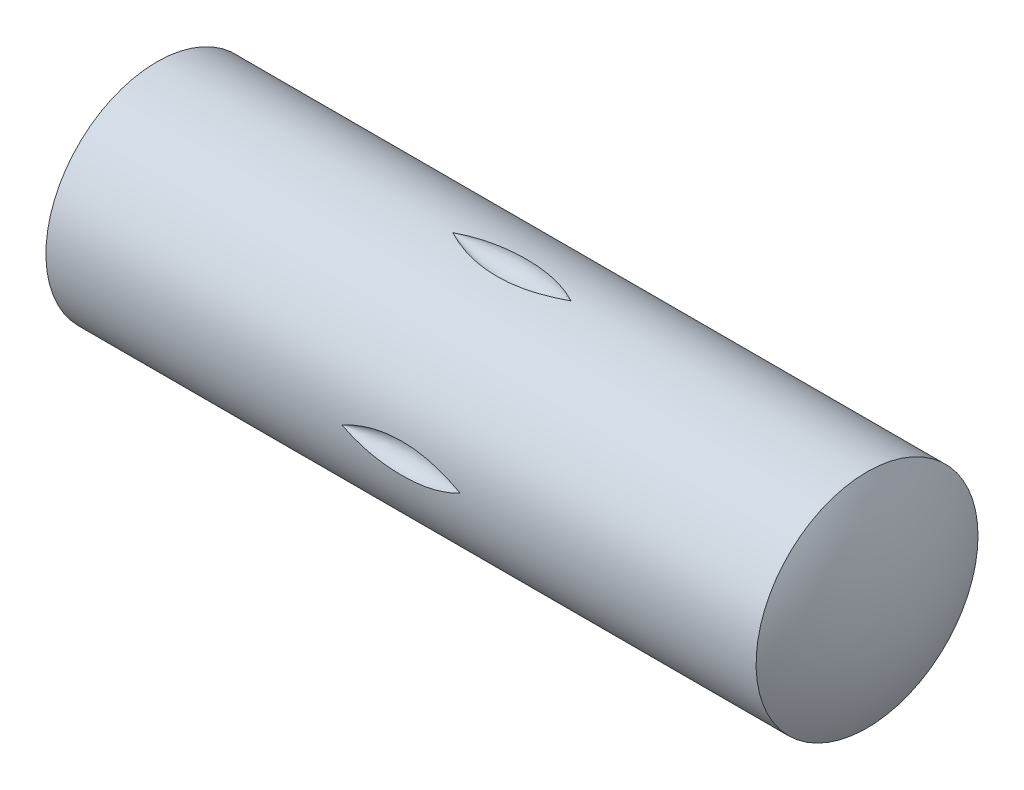
ISO-10303-21;
HEADER;
FILE_DESCRIPTION(('STEP AP214'),'2;1');
FILE_NAME('part.step','',(''),(''),'','','');
FILE_SCHEMA(('AUTOMOTIVE_DESIGN { 1 0 10303 214 1 1 1 1 }'));
ENDSEC;
DATA;
#1=APPLICATION_CONTEXT('core data for automotive mechanical design processes');
#2=APPLICATION_PROTOCOL_DEFINITION('international standard','automotive_design',2000,#1);
#3=PRODUCT_CONTEXT('',#1,'mechanical');
#4=PRODUCT('Part','Part','',(#3));
#5=PRODUCT_RELATED_PRODUCT_CATEGORY('part','',(#4));
#6=PRODUCT_DEFINITION_FORMATION('','',#4);
#7=PRODUCT_DEFINITION_CONTEXT('part definition',#1,'design');
#8=PRODUCT_DEFINITION('design','',#6,#7);
#9=PRODUCT_DEFINITION_SHAPE('','',#8);
#10=(LENGTH_UNIT() NAMED_UNIT(*) SI_UNIT(.MILLI.,.METRE.));
#11=(NAMED_UNIT(*) PLANE_ANGLE_UNIT() SI_UNIT($,.RADIAN.));
#12=(NAMED_UNIT(*) SI_UNIT($,.STERADIAN.) SOLID_ANGLE_UNIT());
#13=UNCERTAINTY_MEASURE_WITH_UNIT(LENGTH_MEASURE(1.E-05),#10,'distance_accuracy_value','');
#14=(GEOMETRIC_REPRESENTATION_CONTEXT(3) GLOBAL_UNCERTAINTY_ASSIGNED_CONTEXT((#13)) GLOBAL_UNIT_ASSIGNED_CONTEXT((#10,
#11,#12)) REPRESENTATION_CONTEXT('',''));
#15=CARTESIAN_POINT('',(0.,0.,0.));
#16=DIRECTION('',(0.,0.,1.));
#17=DIRECTION('',(1.,0.,0.));
#18=AXIS2_PLACEMENT_3D('',#15,#16,#17);
#19=CARTESIAN_POINT('',(-3.67082089552239,0.,0.));
#20=DIRECTION('',(1.,0.,0.));
#21=DIRECTION('',(0.,1.,0.));
#22=AXIS2_PLACEMENT_3D('',#19,#20,#21);
#23=SPHERICAL_SURFACE('',#22,4.99917910447761);
#24=CARTESIAN_POINT('',(-8.,0.,0.));
#25=DIRECTION('',(1.,0.,0.));
#26=DIRECTION('',(0.,0.,-0.999999999999999));
#27=AXIS2_PLACEMENT_3D('',#24,#25,#26);
#28=CIRCLE('',#27,2.5);
#29=CARTESIAN_POINT('',(-8.,0.,-2.5));
#30=VERTEX_POINT('',#29);
#31=EDGE_CURVE('E94',#30,#30,#28,.T.);
#32=ORIENTED_EDGE('',*,*,#31,.F.);
#33=EDGE_LOOP('',(#32));
#34=FACE_BOUND('',#33,.T.);
#35=ADVANCED_FACE('F31',(#34),#23,.T.);
#36=CARTESIAN_POINT('',(3.67082089552239,0.,0.));
#37=DIRECTION('',(1.,0.,0.));
#38=DIRECTION('',(0.,1.,0.));
#39=AXIS2_PLACEMENT_3D('',#36,#37,#38);
#40=SPHERICAL_SURFACE('',#39,4.99917910447761);
#41=CARTESIAN_POINT('',(8.,0.,0.));
#42=DIRECTION('',(1.,0.,0.));
#43=DIRECTION('',(0.,0.,-0.999999999999999));
#44=AXIS2_PLACEMENT_3D('',#41,#42,#43);
#45=CIRCLE('',#44,2.5);
#46=CARTESIAN_POINT('',(8.,0.,-2.5));
#47=VERTEX_POINT('',#46);
#48=EDGE_CURVE('E91',#47,#47,#45,.T.);
#49=ORIENTED_EDGE('',*,*,#48,.T.);
#50=EDGE_LOOP('',(#49));
#51=FACE_BOUND('',#50,.T.);
#52=ADVANCED_FACE('F77',(#51),#40,.T.);
#53=CARTESIAN_POINT('',(0.,0.,0.));
#54=DIRECTION('',(1.,0.,0.));
#55=DIRECTION('',(0.,0.,-0.999999999999999));
#56=AXIS2_PLACEMENT_3D('',#53,#54,#55);
#57=CYLINDRICAL_SURFACE('',#56,2.5);
#58=CARTESIAN_POINT('',(1.33333333333333,0.,2.5));
#59=CARTESIAN_POINT('',(1.33332368564111,5.17462142847804E-06,2.50000000000001));
#60=CARTESIAN_POINT('',(1.33331403791877,1.03491866655168E-05,2.49999999998396));
#61=CARTESIAN_POINT('',(1.33324564022868,4.70338413822208E-05,2.49999999975621));
#62=CARTESIAN_POINT('',(1.33318688917402,7.85419043569052E-05,2.4999999989648));
#63=CARTESIAN_POINT('',(1.33289312831383,0.000236071806838235,2.49999999203023));
#64=CARTESIAN_POINT('',(1.33265810175452,0.000362062405372546,2.49999997695459));
#65=CARTESIAN_POINT('',(1.33148287950365,0.000991848828509798,2.49999985401855));
#66=CARTESIAN_POINT('',(1.33054241590107,0.00149514470202533,2.4999996034847));
#67=CARTESIAN_POINT('',(1.32583866191508,0.00400896128297524,2.49999759442673));
#68=CARTESIAN_POINT('',(1.32207109251311,0.006011478128897,2.49999356673639));
#69=CARTESIAN_POINT('',(1.30320998841814,0.0159815713122118,2.49996164491182));
#70=CARTESIAN_POINT('',(1.28804852392267,0.0238206867977151,2.49989840070786));
#71=CARTESIAN_POINT('',(1.21185068391944,0.0623444224100758,2.49941250462188));
#72=CARTESIAN_POINT('',(1.14975900483624,0.090951160927654,2.49848087962319));
#73=CARTESIAN_POINT('',(0.958997096486229,0.170509735553731,2.49475414810175));
#74=CARTESIAN_POINT('',(0.827292200752795,0.214326321542296,2.49102774130046));
#75=CARTESIAN_POINT('',(0.558697822666952,0.282165632075253,2.48426076885348));
#76=CARTESIAN_POINT('',(0.421800467953406,0.306156933211705,2.48122129752971));
#77=CARTESIAN_POINT('',(0.146052524362845,0.333872435285845,2.47764575047314));
#78=CARTESIAN_POINT('',(0.00720387350283834,0.337615492329434,2.47710734569698));
#79=CARTESIAN_POINT('',(-0.269573981474224,0.324815783167228,2.47881686716515));
#80=CARTESIAN_POINT('',(-0.407502955742722,0.308268123800132,2.48106546550424));
#81=CARTESIAN_POINT('',(-0.681276312670309,0.254779219495499,2.48713117020585));
#82=CARTESIAN_POINT('',(-0.817065146820702,0.217557958844302,2.4909696248895));
#83=CARTESIAN_POINT('',(-1.08137548561947,0.123242450300256,2.49740237368179));
#84=CARTESIAN_POINT('',(-1.20991343243434,0.0661954538791813,2.49999959143125));
#85=CARTESIAN_POINT('',(-1.33331403792012,1.03491863698692E-05,2.49999999998375));
#86=CARTESIAN_POINT('',(-1.33332368564246,5.174621115446E-06,2.49999999999981));
#87=CARTESIAN_POINT('',(-1.33333333333333,0.,2.5));
#88=B_SPLINE_CURVE_WITH_KNOTS('',3,(#58,#59,#60,#61,#62,#63,#64,#65,#66,#67,#68,#69,#70,#71,#72,
#73,#74,#75,#76,#77,#78,#79,#80,#81,#82,#83,#84,#85,#86,#87),.UNSPECIFIED.,.F.,.F.,(4,2,2,2,2,2,
2,2,2,2,2,2,2,2,4),(0.,3.28434475357703E-05,0.000232843447666263,0.00103284345621928,
0.00423284400343815,0.0170328789879499,0.0682351085112956,0.273175908324789,0.688090777114765,
1.10366203827783,1.51884623346303,1.93413057113689,2.35518198712805,2.77523669940598,
2.77526954285353),.UNSPECIFIED.);
#89=CARTESIAN_POINT('',(-1.33333333333333,0.,2.5));
#90=VERTEX_POINT('',#89);
#91=CARTESIAN_POINT('',(1.33333333333333,0.,2.5));
#92=VERTEX_POINT('',#91);
#93=EDGE_CURVE('E43',#90,#92,#88,.F.);
#94=ORIENTED_EDGE('',*,*,#93,.T.);
#95=CARTESIAN_POINT('',(1.33333333333333,0.,2.5));
#96=CARTESIAN_POINT('',(1.33332368564111,-5.17462137567127E-06,2.5));
#97=CARTESIAN_POINT('',(1.33331403791877,-1.03491866150022E-05,2.49999999998394));
#98=CARTESIAN_POINT('',(1.33324564022868,-4.703384134307E-05,2.49999999975614));
#99=CARTESIAN_POINT('',(1.33318688917402,-7.85419043142062E-05,2.49999999896478));
#100=CARTESIAN_POINT('',(1.33289312831382,-0.000236071806780299,2.49999999203038));
#101=CARTESIAN_POINT('',(1.33265810175452,-0.000362062405320087,2.49999997695464));
#102=CARTESIAN_POINT('',(1.33148287950365,-0.000991848828477323,2.49999985401827));
#103=CARTESIAN_POINT('',(1.33054241590107,-0.00149514470198352,2.49999960348457));
#104=CARTESIAN_POINT('',(1.32583866191507,-0.00400896128290181,2.49999759442717));
#105=CARTESIAN_POINT('',(1.3220710925131,-0.00601147812884003,2.49999356673658));
#106=CARTESIAN_POINT('',(1.30320998841816,-0.0159815713122131,2.49996164491108));
#107=CARTESIAN_POINT('',(1.28804852392268,-0.0238206867976893,2.49989840070755));
#108=CARTESIAN_POINT('',(1.2118506839194,-0.0623444224099533,2.49941250462311));
#109=CARTESIAN_POINT('',(1.14975900483622,-0.0909511609275811,2.49848087962362));
#110=CARTESIAN_POINT('',(0.958997096486146,-0.170509735553779,2.49475414810088));
#111=CARTESIAN_POINT('',(0.827292200752576,-0.214326321542321,2.49102774130022));
#112=CARTESIAN_POINT('',(0.558697822666696,-0.282165632075238,2.48426076885371));
#113=CARTESIAN_POINT('',(0.421800467953259,-0.306156933211707,2.48122129752977));
#114=CARTESIAN_POINT('',(0.146052524363204,-0.333872435285725,2.47764575047308));
#115=CARTESIAN_POINT('',(0.00720387350359609,-0.337615492329206,2.47710734569698));
#116=CARTESIAN_POINT('',(-0.269573981473642,-0.324815783167407,2.47881686716516));
#117=CARTESIAN_POINT('',(-0.407502955742711,-0.308268123800731,2.48106546550424));
#118=CARTESIAN_POINT('',(-0.681276312670426,-0.254779219494753,2.48713117020585));
#119=CARTESIAN_POINT('',(-0.817065146820356,-0.217557958841748,2.49096962488953));
#120=CARTESIAN_POINT('',(-1.0813754856215,-0.123242450302091,2.49740237368181));
#121=CARTESIAN_POINT('',(-1.20991343243924,-0.0661954538873227,2.49999959143125));
#122=CARTESIAN_POINT('',(-1.33331403792012,-1.03491863166711E-05,2.49999999998375));
#123=CARTESIAN_POINT('',(-1.33332368564246,-5.17462106109143E-06,2.49999999999981));
#124=CARTESIAN_POINT('',(-1.33333333333333,0.,2.5));
#125=B_SPLINE_CURVE_WITH_KNOTS('',3,(#95,#96,#97,#98,#99,#100,#101,#102,#103,#104,#105,#106,
#107,#108,#109,#110,#111,#112,#113,#114,#115,#116,#117,#118,#119,#120,#121,#122,#123,#124),
.UNSPECIFIED.,.F.,.F.,(4,2,2,2,2,2,2,2,2,2,2,2,2,2,4),(0.,3.284344753905E-05,
0.00023284344767424,0.00103284345622562,0.00423284400344143,0.0170328789879548,
0.0682351085113005,0.273175908324793,0.688090777115132,1.10366203827784,1.51884623346203,
1.9341305711369,2.35518198712939,2.77523669940598,2.77526954285353),.UNSPECIFIED.);
#126=EDGE_CURVE('E11',#92,#90,#125,.T.);
#127=ORIENTED_EDGE('',*,*,#126,.T.);
#128=EDGE_LOOP('',(#94,#127));
#129=FACE_BOUND('',#128,.T.);
#130=CARTESIAN_POINT('',(1.33333333333333,-2.5,0.));
#131=CARTESIAN_POINT('',(1.33332368564111,-2.5,5.17462141728913E-06));
#132=CARTESIAN_POINT('',(1.33331403791877,-2.49999999998393,1.03491866566207E-05));
#133=CARTESIAN_POINT('',(1.33324564022868,-2.49999999975613,4.70338413843124E-05));
#134=CARTESIAN_POINT('',(1.33318688917403,-2.49999999896477,7.85419043555873E-05));
#135=CARTESIAN_POINT('',(1.33289312831382,-2.49999999203041,0.000236071806825901));
#136=CARTESIAN_POINT('',(1.33265810175452,-2.49999997695465,0.000362062405371474));
#137=CARTESIAN_POINT('',(1.33148287950366,-2.4999998540182,0.000991848828544652));
#138=CARTESIAN_POINT('',(1.33054241590108,-2.49999960348455,0.0014951447020361));
#139=CARTESIAN_POINT('',(1.32583866191505,-2.49999759442729,0.00400896128290107));
#140=CARTESIAN_POINT('',(1.32207109251309,-2.49999356673663,0.00601147812885761));
#141=CARTESIAN_POINT('',(1.30320998841819,-2.49996164491087,0.0159815713123044));
#142=CARTESIAN_POINT('',(1.28804852392269,-2.49989840070746,0.0238206867977657));
#143=CARTESIAN_POINT('',(1.21185068391937,-2.49941250462345,0.062344422409966));
#144=CARTESIAN_POINT('',(1.14975900483621,-2.49848087962374,0.0909511609276133));
#145=CARTESIAN_POINT('',(0.958997096485816,-2.49475414810062,0.170509735553976));
#146=CARTESIAN_POINT('',(0.827292200751884,-2.49102774130015,0.21432632154257));
#147=CARTESIAN_POINT('',(0.558697822665933,-2.48426076885374,0.28216563207544));
#148=CARTESIAN_POINT('',(0.421800467952813,-2.48122129752971,0.306156933211918));
#149=CARTESIAN_POINT('',(0.14605252436431,-2.47764575047316,0.333872435285531));
#150=CARTESIAN_POINT('',(0.00720387350594862,-2.47710734569726,0.337615492328696));
#151=CARTESIAN_POINT('',(-0.269573981471831,-2.47881686716484,0.324815783168191));
#152=CARTESIAN_POINT('',(-0.407502955742673,-2.48106546550315,0.30826812380282));
#153=CARTESIAN_POINT('',(-0.681276312670683,-2.48713117020691,0.254779219492695));
#154=CARTESIAN_POINT('',(-0.817065146819081,-2.49096962489357,0.217557958834108));
#155=CARTESIAN_POINT('',(-1.0813754856276,-2.4974023736779,0.123242450308074));
#156=CARTESIAN_POINT('',(-1.20991343245434,-2.49999959141646,0.0661954539128166));
#157=CARTESIAN_POINT('',(-1.33331403792012,-2.49999999998374,1.03491863629306E-05));
#158=CARTESIAN_POINT('',(-1.33332368564246,-2.49999999999981,5.17462110503804E-06));
#159=CARTESIAN_POINT('',(-1.33333333333333,-2.5,0.));
#160=B_SPLINE_CURVE_WITH_KNOTS('',3,(#130,#131,#132,#133,#134,#135,#136,#137,#138,#139,#140,
#141,#142,#143,#144,#145,#146,#147,#148,#149,#150,#151,#152,#153,#154,#155,#156,#157,#158,#159),
.UNSPECIFIED.,.F.,.F.,(4,2,2,2,2,2,2,2,2,2,2,2,2,2,4),(0.,3.284344753905E-05,
0.000232843447671182,0.00103284345622912,0.00423284400344144,0.01703287898795,
0.0682351085113116,0.273175908324792,0.688090777116255,1.10366203827784,1.51884623345892,
1.93413057113689,2.35518198713323,2.77523669940598,2.77526954285354),.UNSPECIFIED.);
#161=CARTESIAN_POINT('',(-1.33333333333333,-2.5,0.));
#162=VERTEX_POINT('',#161);
#163=CARTESIAN_POINT('',(1.33333333333333,-2.5,0.));
#164=VERTEX_POINT('',#163);
#165=EDGE_CURVE('E79',#162,#164,#160,.F.);
#166=ORIENTED_EDGE('',*,*,#165,.T.);
#167=CARTESIAN_POINT('',(1.33333333333333,-2.5,0.));
#168=CARTESIAN_POINT('',(1.33332368564111,-2.5,-5.17462138410739E-06));
#169=CARTESIAN_POINT('',(1.33331403791877,-2.49999999998393,-1.0349186618856E-05));
#170=CARTESIAN_POINT('',(1.33324564022867,-2.49999999975614,-4.70338413258956E-05));
#171=CARTESIAN_POINT('',(1.33318688917402,-2.49999999896477,-7.85419043068734E-05));
#172=CARTESIAN_POINT('',(1.33289312831383,-2.49999999203037,-0.000236071806810663));
#173=CARTESIAN_POINT('',(1.33265810175452,-2.49999997695463,-0.000362062405340673));
#174=CARTESIAN_POINT('',(1.33148287950364,-2.49999985401824,-0.000991848828460238));
#175=CARTESIAN_POINT('',(1.33054241590107,-2.49999960348457,-0.0014951447019846));
#176=CARTESIAN_POINT('',(1.3258386619151,-2.49999759442721,-0.00400896128296612));
#177=CARTESIAN_POINT('',(1.32207109251311,-2.4999935667366,-0.00601147812886894));
#178=CARTESIAN_POINT('',(1.30320998841811,-2.49996164491102,-0.0159815713121188));
#179=CARTESIAN_POINT('',(1.28804852392266,-2.49989840070753,-0.0238206867976566));
#180=CARTESIAN_POINT('',(1.21185068391949,-2.49941250462321,-0.0623444224101313));
#181=CARTESIAN_POINT('',(1.14975900483626,-2.49848087962365,-0.0909511609276327));
#182=CARTESIAN_POINT('',(0.958997096486951,-2.49475414810081,-0.170509735553299));
#183=CARTESIAN_POINT('',(0.827292200754332,-2.49102774130027,-0.214326321541786));
#184=CARTESIAN_POINT('',(0.558697822668659,-2.48426076885376,-0.282165632074862));
#185=CARTESIAN_POINT('',(0.421800467954408,-2.48122129752971,-0.30615693321127));
#186=CARTESIAN_POINT('',(0.146052524360249,-2.47764575047312,-0.333872435286343));
#187=CARTESIAN_POINT('',(0.00720387349732699,-2.47710734569724,-0.337615492330673));
#188=CARTESIAN_POINT('',(-0.269573981478474,-2.47881686716496,-0.324815783165454));
#189=CARTESIAN_POINT('',(-0.407502955742827,-2.48106546550323,-0.308268123795318));
#190=CARTESIAN_POINT('',(-0.681276312669355,-2.4871311702068,-0.254779219500393));
#191=CARTESIAN_POINT('',(-0.817065146822971,-2.49096962489329,-0.217557958862289));
#192=CARTESIAN_POINT('',(-1.08137548560465,-2.49740237367772,-0.123242450286707));
#193=CARTESIAN_POINT('',(-1.20991343239895,-2.49999959141646,-0.0661954538201903));
#194=CARTESIAN_POINT('',(-1.33331403792012,-2.49999999998374,-1.03491863166703E-05));
#195=CARTESIAN_POINT('',(-1.33332368564246,-2.49999999999981,-5.17462106802956E-06));
#196=CARTESIAN_POINT('',(-1.33333333333333,-2.5,0.));
#197=B_SPLINE_CURVE_WITH_KNOTS('',3,(#167,#168,#169,#170,#171,#172,#173,#174,#175,#176,#177,
#178,#179,#180,#181,#182,#183,#184,#185,#186,#187,#188,#189,#190,#191,#192,#193,#194,#195,#196),
.UNSPECIFIED.,.F.,.F.,(4,2,2,2,2,2,2,2,2,2,2,2,2,2,4),(0.,3.28434475324906E-05,
0.000232843447667681,0.00103284345622562,0.00423284400344143,0.0170328789879499,
0.0682351085113019,0.273175908324785,0.688090777112264,1.10366203827783,1.51884623347033,
1.9341305711369,2.35518198711807,2.77523669940598,2.77526954285352),.UNSPECIFIED.);
#198=EDGE_CURVE('E54',#164,#162,#197,.T.);
#199=ORIENTED_EDGE('',*,*,#198,.T.);
#200=EDGE_LOOP('',(#166,#199));
#201=FACE_BOUND('',#200,.T.);
#202=CARTESIAN_POINT('',(1.33333333333333,0.,-2.5));
#203=CARTESIAN_POINT('',(1.33332368564111,-5.17462141333109E-06,-2.5));
#204=CARTESIAN_POINT('',(1.33331403791877,-1.03491866492196E-05,-2.49999999998394));
#205=CARTESIAN_POINT('',(1.33324564022868,-4.70338413637259E-05,-2.49999999975614));
#206=CARTESIAN_POINT('',(1.33318688917403,-7.85419043409768E-05,-2.49999999896477));
#207=CARTESIAN_POINT('',(1.33289312831383,-0.0002360718068296,-2.49999999203034));
#208=CARTESIAN_POINT('',(1.33265810175453,-0.000362062405360899,-2.49999997695463));
#209=CARTESIAN_POINT('',(1.33148287950364,-0.00099184882848674,-2.49999985401832));
#210=CARTESIAN_POINT('',(1.33054241590107,-0.0014951447020056,-2.4999996034846));
#211=CARTESIAN_POINT('',(1.32583866191509,-0.00400896128296871,-2.49999759442707));
#212=CARTESIAN_POINT('',(1.32207109251311,-0.00601147812888619,-2.49999356673654));
#213=CARTESIAN_POINT('',(1.30320998841813,-0.0159815713121844,-2.49996164491124));
#214=CARTESIAN_POINT('',(1.28804852392267,-0.0238206867976936,-2.49989840070761));
#215=CARTESIAN_POINT('',(1.21185068391945,-0.0623444224100764,-2.49941250462281));
#216=CARTESIAN_POINT('',(1.14975900483624,-0.0909511609276458,-2.49848087962351));
#217=CARTESIAN_POINT('',(0.958997096486176,-0.170509735553725,-2.49475414810107));
#218=CARTESIAN_POINT('',(0.827292200752697,-0.214326321542304,-2.49102774130028));
#219=CARTESIAN_POINT('',(0.55869782266685,-0.282165632075261,-2.48426076885366));
#220=CARTESIAN_POINT('',(0.421800467953347,-0.306156933211712,-2.48122129752976));
#221=CARTESIAN_POINT('',(0.146052524362977,-0.333872435285803,-2.47764575047309));
#222=CARTESIAN_POINT('',(0.00720387350311956,-0.337615492329356,-2.47710734569698));
#223=CARTESIAN_POINT('',(-0.269573981474005,-0.324815783167295,-2.47881686716515));
#224=CARTESIAN_POINT('',(-0.407502955742713,-0.308268123800346,-2.48106546550422));
#225=CARTESIAN_POINT('',(-0.68127631267035,-0.25477921949522,-2.48713117020582));
#226=CARTESIAN_POINT('',(-0.817065146820576,-0.217557958843367,-2.49096962488951));
#227=CARTESIAN_POINT('',(-1.08137548562021,-0.123242450300933,-2.49740237368181));
#228=CARTESIAN_POINT('',(-1.20991343243614,-0.0661954538821663,-2.49999959143125));
#229=CARTESIAN_POINT('',(-1.33331403792012,-1.0349186352522E-05,-2.49999999998375));
#230=CARTESIAN_POINT('',(-1.33332368564246,-5.1746210980988E-06,-2.49999999999981));
#231=CARTESIAN_POINT('',(-1.33333333333333,0.,-2.5));
#232=B_SPLINE_CURVE_WITH_KNOTS('',3,(#202,#203,#204,#205,#206,#207,#208,#209,#210,#211,#212,
#213,#214,#215,#216,#217,#218,#219,#220,#221,#222,#223,#224,#225,#226,#227,#228,#229,#230,#231),
.UNSPECIFIED.,.F.,.F.,(4,2,2,2,2,2,2,2,2,2,2,2,2,2,4),(0.,3.2843447531073E-05,
0.000232843447666263,0.00103284345621928,0.00423284400343652,0.0170328789879499,
0.068235108511294,0.273175908324789,0.688090777114917,1.10366203827783,1.51884623346266,
1.93413057113689,2.35518198712854,2.77523669940598,2.77526954285353),.UNSPECIFIED.);
#233=CARTESIAN_POINT('',(-1.33333333333333,0.,-2.5));
#234=VERTEX_POINT('',#233);
#235=CARTESIAN_POINT('',(1.33333333333333,0.,-2.5));
#236=VERTEX_POINT('',#235);
#237=EDGE_CURVE('E83',#234,#236,#232,.F.);
#238=ORIENTED_EDGE('',*,*,#237,.T.);
#239=CARTESIAN_POINT('',(1.33333333333333,0.,-2.5));
#240=CARTESIAN_POINT('',(1.33332368564111,5.1746213894913E-06,-2.5));
#241=CARTESIAN_POINT('',(1.33331403791877,1.03491866288259E-05,-2.49999999998394));
#242=CARTESIAN_POINT('',(1.33324564022868,4.7033841357054E-05,-2.49999999975614));
#243=CARTESIAN_POINT('',(1.33318688917403,7.85419043301686E-05,-2.49999999896477));
#244=CARTESIAN_POINT('',(1.33289312831382,0.000236071806804819,-2.49999999203034));
#245=CARTESIAN_POINT('',(1.33265810175452,0.000362062405342282,-2.49999997695462));
#246=CARTESIAN_POINT('',(1.33148287950365,0.000991848828489926,-2.49999985401829));
#247=CARTESIAN_POINT('',(1.33054241590107,0.00149514470200305,-2.49999960348457));
#248=CARTESIAN_POINT('',(1.32583866191508,0.00400896128294305,-2.49999759442706));
#249=CARTESIAN_POINT('',(1.3220710925131,0.00601147812886339,-2.49999356673653));
#250=CARTESIAN_POINT('',(1.30320998841814,0.0159815713121763,-2.49996164491126));
#251=CARTESIAN_POINT('',(1.28804852392267,0.0238206867976842,-2.49989840070762));
#252=CARTESIAN_POINT('',(1.21185068391944,0.0623444224100582,-2.49941250462281));
#253=CARTESIAN_POINT('',(1.14975900483624,0.0909511609276258,-2.49848087962351));
#254=CARTESIAN_POINT('',(0.958997096485868,0.170509735553823,-2.49475414810111));
#255=CARTESIAN_POINT('',(0.827292200752073,0.214326321542467,-2.49102774130043));
#256=CARTESIAN_POINT('',(0.558697822666173,0.282165632075386,-2.48426076885348));
#257=CARTESIAN_POINT('',(0.421800467952959,0.30615693321183,-2.48122129752914));
#258=CARTESIAN_POINT('',(0.146052524363768,0.33387243528561,-2.47764575047369));
#259=CARTESIAN_POINT('',(0.00720387350480785,0.337615492328917,-2.47710734569922));
#260=CARTESIAN_POINT('',(-0.269573981472732,0.324815783167828,-2.4788168671629));
#261=CARTESIAN_POINT('',(-0.407502955742742,0.308268123801881,-2.48106546549585));
#262=CARTESIAN_POINT('',(-0.681276312669791,0.254779219493747,-2.48713117021429));
#263=CARTESIAN_POINT('',(-0.817065146818105,0.217557958837893,-2.49096962492132));
#264=CARTESIAN_POINT('',(-1.08137548562345,0.123242450306078,-2.49740237365009));
#265=CARTESIAN_POINT('',(-1.20991343244698,0.0661954539019451,-2.49999959131291));
#266=CARTESIAN_POINT('',(-1.33331403792012,1.03491863363314E-05,-2.49999999998373));
#267=CARTESIAN_POINT('',(-1.33332368564246,5.1746210795953E-06,-2.4999999999998));
#268=CARTESIAN_POINT('',(-1.33333333333333,0.,-2.5));
#269=B_SPLINE_CURVE_WITH_KNOTS('',3,(#239,#240,#241,#242,#243,#244,#245,#246,#247,#248,#249,
#250,#251,#252,#253,#254,#255,#256,#257,#258,#259,#260,#261,#262,#263,#264,#265,#266,#267,#268),
.UNSPECIFIED.,.F.,.F.,(4,2,2,2,2,2,2,2,2,2,2,2,2,2,4),(0.,3.284344753905E-05,
0.000232843447672822,0.0010328434562289,0.00423284400344635,0.0170328789879532,
0.0682351085113021,0.273175908324791,0.688090777115924,1.10366203827784,1.51884623346045,
1.9341305711369,2.35518198712916,2.77523669940598,2.77526954285353),.UNSPECIFIED.);
#270=EDGE_CURVE('E122',#236,#234,#269,.T.);
#271=ORIENTED_EDGE('',*,*,#270,.T.);
#272=EDGE_LOOP('',(#238,#271));
#273=FACE_BOUND('',#272,.T.);
#274=CARTESIAN_POINT('',(1.33333333333333,2.5,0.));
#275=CARTESIAN_POINT('',(1.33332368564111,2.5,-5.17462140356244E-06));
#276=CARTESIAN_POINT('',(1.33331403791877,2.49999999998394,-1.03491866428844E-05));
#277=CARTESIAN_POINT('',(1.33324564022868,2.49999999975614,-4.70338413685394E-05));
#278=CARTESIAN_POINT('',(1.33318688917403,2.49999999896477,-7.85419043330265E-05));
#279=CARTESIAN_POINT('',(1.33289312831381,2.49999999203036,-0.000236071806781981));
#280=CARTESIAN_POINT('',(1.33265810175452,2.49999997695463,-0.000362062405336874));
#281=CARTESIAN_POINT('',(1.33148287950368,2.49999985401828,-0.000991848828541866));
#282=CARTESIAN_POINT('',(1.33054241590108,2.49999960348458,-0.00149514470201868));
#283=CARTESIAN_POINT('',(1.32583866191502,2.49999759442715,-0.00400896128283494));
#284=CARTESIAN_POINT('',(1.32207109251308,2.49999356673657,-0.00601147812882211));
#285=CARTESIAN_POINT('',(1.30320998841824,2.49996164491111,-0.015981571312371));
#286=CARTESIAN_POINT('',(1.28804852392271,2.49989840070756,-0.0238206867977691));
#287=CARTESIAN_POINT('',(1.21185068391928,2.49941250462305,-0.0623444224097535));
#288=CARTESIAN_POINT('',(1.14975900483619,2.4984808796236,-0.0909511609275191));
#289=CARTESIAN_POINT('',(0.9589970964871,2.49475414810092,-0.170509735553613));
#290=CARTESIAN_POINT('',(0.827292200754364,2.49102774130028,-0.214326321541882));
#291=CARTESIAN_POINT('',(0.558697822668603,2.48426076885375,-0.282165632074799));
#292=CARTESIAN_POINT('',(0.421800467954381,2.48122129752979,-0.306156933211269));
#293=CARTESIAN_POINT('',(0.146052524360383,2.47764575047306,-0.333872435286333));
#294=CARTESIAN_POINT('',(0.00720387349759325,2.47710734569696,-0.33761549233061));
#295=CARTESIAN_POINT('',(-0.269573981478279,2.47881686716523,-0.324815783165566));
#296=CARTESIAN_POINT('',(-0.407502955742835,2.48106546550427,-0.308268123795625));
#297=CARTESIAN_POINT('',(-0.681276312669498,2.48713117020575,-0.254779219500192));
#298=CARTESIAN_POINT('',(-0.817065146823035,2.49096962488933,-0.21755795886135));
#299=CARTESIAN_POINT('',(-1.08137548560557,2.49740237368169,-0.123242450287319));
#300=CARTESIAN_POINT('',(-1.20991343240084,2.49999959143125,-0.0661954538231601));
#301=CARTESIAN_POINT('',(-1.33331403792012,2.49999999998375,-1.03491863305481E-05));
#302=CARTESIAN_POINT('',(-1.33332368564246,2.49999999999981,-5.17462108190738E-06));
#303=CARTESIAN_POINT('',(-1.33333333333333,2.5,0.));
#304=B_SPLINE_CURVE_WITH_KNOTS('',3,(#274,#275,#276,#277,#278,#279,#280,#281,#282,#283,#284,
#285,#286,#287,#288,#289,#290,#291,#292,#293,#294,#295,#296,#297,#298,#299,#300,#301,#302,#303),
.UNSPECIFIED.,.F.,.F.,(4,2,2,2,2,2,2,2,2,2,2,2,2,2,4),(0.,3.284344753905E-05,
0.000232843447664624,0.00103284345622562,0.00423284400343488,0.0170328789879499,
0.0682351085112988,0.273175908324791,0.688090777112284,1.10366203827783,1.51884623346999,
1.93413057113689,2.35518198711886,2.77523669940599,2.77526954285353),.UNSPECIFIED.);
#305=CARTESIAN_POINT('',(-1.33333333333333,2.5,0.));
#306=VERTEX_POINT('',#305);
#307=CARTESIAN_POINT('',(1.33333333333333,2.5,0.));
#308=VERTEX_POINT('',#307);
#309=EDGE_CURVE('E87',#306,#308,#304,.F.);
#310=ORIENTED_EDGE('',*,*,#309,.T.);
#311=CARTESIAN_POINT('',(1.33333333333333,2.5,0.));
#312=CARTESIAN_POINT('',(1.33332368564111,2.5,5.17462140340576E-06));
#313=CARTESIAN_POINT('',(1.33331403791877,2.49999999998394,1.03491866427381E-05));
#314=CARTESIAN_POINT('',(1.33324564022868,2.49999999975614,4.70338413704638E-05));
#315=CARTESIAN_POINT('',(1.33318688917403,2.49999999896478,7.85419043419166E-05));
#316=CARTESIAN_POINT('',(1.33289312831382,2.49999999203038,0.000236071806810644));
#317=CARTESIAN_POINT('',(1.33265810175452,2.49999997695464,0.000362062405348677));
#318=CARTESIAN_POINT('',(1.33148287950365,2.49999985401825,0.000991848828500847));
#319=CARTESIAN_POINT('',(1.33054241590107,2.49999960348457,0.00149514470201754));
#320=CARTESIAN_POINT('',(1.32583866191508,2.49999759442722,0.00400896128296899));
#321=CARTESIAN_POINT('',(1.32207109251311,2.4999935667366,0.00601147812888648));
#322=CARTESIAN_POINT('',(1.30320998841813,2.499961644911,0.015981571312186));
#323=CARTESIAN_POINT('',(1.28804852392267,2.49989840070752,0.0238206867976921));
#324=CARTESIAN_POINT('',(1.21185068391944,2.49941250462323,0.0623444224100666));
#325=CARTESIAN_POINT('',(1.14975900483624,2.49848087962366,0.090951160927649));
#326=CARTESIAN_POINT('',(0.958997096485773,2.49475414810076,0.1705097355539));
#327=CARTESIAN_POINT('',(0.827292200751868,2.49102774130017,0.214326321542537));
#328=CARTESIAN_POINT('',(0.558697822665939,2.48426076885373,0.282165632075447));
#329=CARTESIAN_POINT('',(0.421800467952815,2.48122129752978,0.306156933211922));
#330=CARTESIAN_POINT('',(0.14605252436432,2.4776457504731,0.333872435285526));
#331=CARTESIAN_POINT('',(0.00720387350597077,2.47710734569699,0.337615492328688));
#332=CARTESIAN_POINT('',(-0.269573981471809,2.47881686716512,0.324815783168175));
#333=CARTESIAN_POINT('',(-0.407502955742663,2.48106546550419,0.308268123802795));
#334=CARTESIAN_POINT('',(-0.681276312670793,2.48713117020585,0.254779219492647));
#335=CARTESIAN_POINT('',(-0.817065146819295,2.4909696248896,0.217557958834033));
#336=CARTESIAN_POINT('',(-1.0813754856278,2.49740237368187,0.123242450307975));
#337=CARTESIAN_POINT('',(-1.20991343245444,2.49999959143125,0.0661954539127507));
#338=CARTESIAN_POINT('',(-1.33331403792012,2.49999999998375,1.03491863490529E-05));
#339=CARTESIAN_POINT('',(-1.33332368564246,2.49999999999981,5.17462109116025E-06));
#340=CARTESIAN_POINT('',(-1.33333333333333,2.5,0.));
#341=B_SPLINE_CURVE_WITH_KNOTS('',3,(#311,#312,#313,#314,#315,#316,#317,#318,#319,#320,#321,
#322,#323,#324,#325,#326,#327,#328,#329,#330,#331,#332,#333,#334,#335,#336,#337,#338,#339,#340),
.UNSPECIFIED.,.F.,.F.,(4,2,2,2,2,2,2,2,2,2,2,2,2,2,4),(0.,3.284344753905E-05,
0.000232843447671182,0.00103284345622562,0.00423284400344798,0.0170328789879565,
0.068235108511299,0.273175908324797,0.688090777116261,1.10366203827784,1.51884623345889,
1.9341305711369,2.35518198713356,2.77523669940598,2.77526954285354),.UNSPECIFIED.);
#342=EDGE_CURVE('E104',#308,#306,#341,.T.);
#343=ORIENTED_EDGE('',*,*,#342,.T.);
#344=EDGE_LOOP('',(#310,#343));
#345=FACE_BOUND('',#344,.T.);
#346=ORIENTED_EDGE('',*,*,#48,.F.);
#347=EDGE_LOOP('',(#346));
#348=FACE_BOUND('',#347,.T.);
#349=ORIENTED_EDGE('',*,*,#31,.T.);
#350=EDGE_LOOP('',(#349));
#351=FACE_BOUND('',#350,.T.);
#352=ADVANCED_FACE('F73',(#129,#201,#273,#345,#348,#351),#57,.T.);
#353=CARTESIAN_POINT('',(0.,2.5,-2.48589966832504));
#354=DIRECTION('',(0.,-0.999999999999999,0.));
#355=DIRECTION('',(0.,0.,0.999999999999999));
#356=AXIS2_PLACEMENT_3D('',#353,#354,#355);
#357=CIRCLE('',#356,2.82089966832504);
#358=TRIMMED_CURVE('',#357,(PARAMETER_VALUE(-0.492309574507561)),
(PARAMETER_VALUE(0.492309574507561)),.T.,.PARAMETER.);
#359=CARTESIAN_POINT('',(0.,2.5,0.));
#360=DIRECTION('',(-1.,0.,0.));
#361=AXIS1_PLACEMENT('',#359,#360);
#362=SURFACE_OF_REVOLUTION('',#358,#361);
#363=ORIENTED_EDGE('',*,*,#309,.F.);
#364=ORIENTED_EDGE('',*,*,#342,.F.);
#365=EDGE_LOOP('',(#363,#364));
#366=FACE_BOUND('',#365,.T.);
#367=ADVANCED_FACE('F76',(#366),#362,.F.);
#368=CARTESIAN_POINT('',(0.,-2.48589966832505,-2.49999999999999));
#369=DIRECTION('',(0.,0.,1.));
#370=DIRECTION('',(0.,1.,0.));
#371=AXIS2_PLACEMENT_3D('',#368,#369,#370);
#372=CIRCLE('',#371,2.82089966832504);
#373=TRIMMED_CURVE('',#372,(PARAMETER_VALUE(-0.492309574507561)),
(PARAMETER_VALUE(0.492309574507561)),.T.,.PARAMETER.);
#374=CARTESIAN_POINT('',(0.,0.,-2.5));
#375=DIRECTION('',(-1.,0.,0.));
#376=AXIS1_PLACEMENT('',#374,#375);
#377=SURFACE_OF_REVOLUTION('',#373,#376);
#378=ORIENTED_EDGE('',*,*,#237,.F.);
#379=ORIENTED_EDGE('',*,*,#270,.F.);
#380=EDGE_LOOP('',(#378,#379));
#381=FACE_BOUND('',#380,.T.);
#382=ADVANCED_FACE('F145',(#381),#377,.F.);
#383=CARTESIAN_POINT('',(0.,-2.49999999999999,2.48589966832505));
#384=DIRECTION('',(0.,0.999999999999999,0.));
#385=DIRECTION('',(0.,0.,-0.999999999999999));
#386=AXIS2_PLACEMENT_3D('',#383,#384,#385);
#387=CIRCLE('',#386,2.82089966832504);
#388=TRIMMED_CURVE('',#387,(PARAMETER_VALUE(-0.492309574507561)),
(PARAMETER_VALUE(0.492309574507561)),.T.,.PARAMETER.);
#389=CARTESIAN_POINT('',(0.,-2.5,0.));
#390=DIRECTION('',(-1.,0.,0.));
#391=AXIS1_PLACEMENT('',#389,#390);
#392=SURFACE_OF_REVOLUTION('',#388,#391);
#393=ORIENTED_EDGE('',*,*,#165,.F.);
#394=ORIENTED_EDGE('',*,*,#198,.F.);
#395=EDGE_LOOP('',(#393,#394));
#396=FACE_BOUND('',#395,.T.);
#397=ADVANCED_FACE('F141',(#396),#392,.F.);
#398=CARTESIAN_POINT('',(0.,2.48589966832507,2.49999999999997));
#399=DIRECTION('',(0.,0.,-1.));
#400=DIRECTION('',(0.,-1.,0.));
#401=AXIS2_PLACEMENT_3D('',#398,#399,#400);
#402=CIRCLE('',#401,2.82089966832504);
#403=TRIMMED_CURVE('',#402,(PARAMETER_VALUE(-0.492309574507561)),
(PARAMETER_VALUE(0.492309574507561)),.T.,.PARAMETER.);
#404=CARTESIAN_POINT('',(0.,0.,2.5));
#405=DIRECTION('',(-1.,0.,0.));
#406=AXIS1_PLACEMENT('',#404,#405);
#407=SURFACE_OF_REVOLUTION('',#403,#406);
#408=ORIENTED_EDGE('',*,*,#93,.F.);
#409=ORIENTED_EDGE('',*,*,#126,.F.);
#410=EDGE_LOOP('',(#408,#409));
#411=FACE_BOUND('',#410,.T.);
#412=ADVANCED_FACE('F71',(#411),#407,.F.);
#413=CLOSED_SHELL('',(#35,#52,#352,#367,#382,#397,#412));
#414=MANIFOLD_SOLID_BREP('B2',#413);
#415=ADVANCED_BREP_SHAPE_REPRESENTATION('',(#18,#414),#14);
#416=SHAPE_DEFINITION_REPRESENTATION(#9,#415);
ENDSEC;
END-ISO-10303-21;
